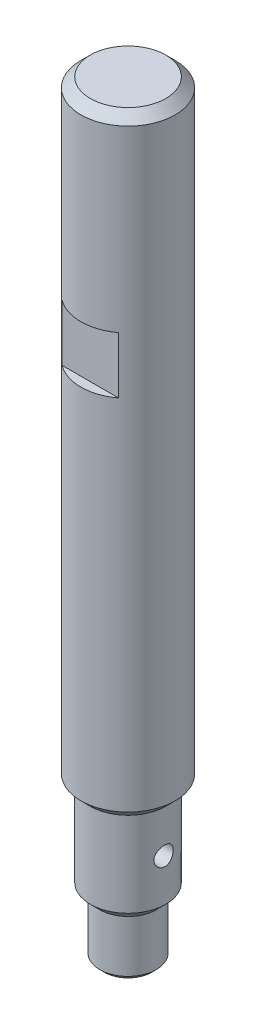
ISO-10303-21;
HEADER;
FILE_DESCRIPTION(('STEP AP214'),'2;1');
FILE_NAME('part.step','',(''),(''),'','','');
FILE_SCHEMA(('AUTOMOTIVE_DESIGN { 1 0 10303 214 1 1 1 1 }'));
ENDSEC;
DATA;
#1=APPLICATION_CONTEXT('core data for automotive mechanical design processes');
#2=APPLICATION_PROTOCOL_DEFINITION('international standard','automotive_design',2000,#1);
#3=PRODUCT_CONTEXT('',#1,'mechanical');
#4=PRODUCT('Part','Part','',(#3));
#5=PRODUCT_RELATED_PRODUCT_CATEGORY('part','',(#4));
#6=PRODUCT_DEFINITION_FORMATION('','',#4);
#7=PRODUCT_DEFINITION_CONTEXT('part definition',#1,'design');
#8=PRODUCT_DEFINITION('design','',#6,#7);
#9=PRODUCT_DEFINITION_SHAPE('','',#8);
#10=(LENGTH_UNIT() NAMED_UNIT(*) SI_UNIT(.MILLI.,.METRE.));
#11=(NAMED_UNIT(*) PLANE_ANGLE_UNIT() SI_UNIT($,.RADIAN.));
#12=(NAMED_UNIT(*) SI_UNIT($,.STERADIAN.) SOLID_ANGLE_UNIT());
#13=UNCERTAINTY_MEASURE_WITH_UNIT(LENGTH_MEASURE(1.E-05),#10,'distance_accuracy_value','');
#14=(GEOMETRIC_REPRESENTATION_CONTEXT(3) GLOBAL_UNCERTAINTY_ASSIGNED_CONTEXT((#13)) GLOBAL_UNIT_ASSIGNED_CONTEXT((#10,
#11,#12)) REPRESENTATION_CONTEXT('',''));
#15=CARTESIAN_POINT('',(0.,0.,0.));
#16=DIRECTION('',(0.,0.,1.));
#17=DIRECTION('',(1.,0.,0.));
#18=AXIS2_PLACEMENT_3D('',#15,#16,#17);
#19=CARTESIAN_POINT('',(0.,0.,0.));
#20=DIRECTION('',(0.,-1.,0.));
#21=DIRECTION('',(0.,0.,-1.));
#22=AXIS2_PLACEMENT_3D('',#19,#20,#21);
#23=CYLINDRICAL_SURFACE('',#22,10.);
#24=DIRECTION('',(0.,-1.,0.));
#25=VECTOR('',#24,1.);
#26=CARTESIAN_POINT('',(6.,0.,-8.));
#27=LINE('',#26,#25);
#28=CARTESIAN_POINT('',(6.,122.,-8.));
#29=VERTEX_POINT('',#28);
#30=CARTESIAN_POINT('',(6.,110.,-8.));
#31=VERTEX_POINT('',#30);
#32=EDGE_CURVE('E100',#29,#31,#27,.T.);
#33=ORIENTED_EDGE('',*,*,#32,.F.);
#34=CARTESIAN_POINT('',(0.,122.,0.));
#35=DIRECTION('',(0.,1.,0.));
#36=DIRECTION('',(0.,0.,1.));
#37=AXIS2_PLACEMENT_3D('',#34,#35,#36);
#38=CIRCLE('',#37,10.);
#39=CARTESIAN_POINT('',(-6.,122.,-8.));
#40=VERTEX_POINT('',#39);
#41=EDGE_CURVE('E88',#29,#40,#38,.T.);
#42=ORIENTED_EDGE('',*,*,#41,.T.);
#43=DIRECTION('',(0.,-1.,0.));
#44=VECTOR('',#43,1.);
#45=CARTESIAN_POINT('',(-6.,0.,-8.));
#46=LINE('',#45,#44);
#47=CARTESIAN_POINT('',(-6.,110.,-8.));
#48=VERTEX_POINT('',#47);
#49=EDGE_CURVE('E96',#48,#40,#46,.F.);
#50=ORIENTED_EDGE('',*,*,#49,.F.);
#51=CARTESIAN_POINT('',(0.,110.,0.));
#52=DIRECTION('',(0.,1.,0.));
#53=DIRECTION('',(0.,0.,1.));
#54=AXIS2_PLACEMENT_3D('',#51,#52,#53);
#55=CIRCLE('',#54,10.);
#56=EDGE_CURVE('E95',#31,#48,#55,.T.);
#57=ORIENTED_EDGE('',*,*,#56,.F.);
#58=EDGE_LOOP('',(#33,#42,#50,#57));
#59=FACE_BOUND('',#58,.T.);
#60=CARTESIAN_POINT('',(0.,34.,0.));
#61=DIRECTION('',(0.,-1.,0.));
#62=DIRECTION('',(0.,0.,-1.));
#63=AXIS2_PLACEMENT_3D('',#60,#61,#62);
#64=CIRCLE('',#63,10.);
#65=CARTESIAN_POINT('',(0.,34.,-10.));
#66=VERTEX_POINT('',#65);
#67=EDGE_CURVE('E161',#66,#66,#64,.T.);
#68=ORIENTED_EDGE('',*,*,#67,.F.);
#69=EDGE_LOOP('',(#68));
#70=FACE_BOUND('',#69,.T.);
#71=CARTESIAN_POINT('',(0.,160.,0.));
#72=DIRECTION('',(0.,-1.,0.));
#73=DIRECTION('',(0.,0.,-1.));
#74=AXIS2_PLACEMENT_3D('',#71,#72,#73);
#75=CIRCLE('',#74,10.);
#76=CARTESIAN_POINT('',(0.,160.,-10.));
#77=VERTEX_POINT('',#76);
#78=EDGE_CURVE('E162',#77,#77,#75,.T.);
#79=ORIENTED_EDGE('',*,*,#78,.T.);
#80=EDGE_LOOP('',(#79));
#81=FACE_BOUND('',#80,.T.);
#82=DIRECTION('',(0.,-1.,0.));
#83=VECTOR('',#82,1.);
#84=CARTESIAN_POINT('',(-6.,0.,8.));
#85=LINE('',#84,#83);
#86=CARTESIAN_POINT('',(-6.,122.,8.));
#87=VERTEX_POINT('',#86);
#88=CARTESIAN_POINT('',(-6.,110.,8.));
#89=VERTEX_POINT('',#88);
#90=EDGE_CURVE('E12',#87,#89,#85,.T.);
#91=ORIENTED_EDGE('',*,*,#90,.F.);
#92=CARTESIAN_POINT('',(6.,122.,8.));
#93=VERTEX_POINT('',#92);
#94=EDGE_CURVE('E98',#87,#93,#38,.T.);
#95=ORIENTED_EDGE('',*,*,#94,.T.);
#96=DIRECTION('',(0.,-1.,0.));
#97=VECTOR('',#96,1.);
#98=CARTESIAN_POINT('',(6.,0.,8.));
#99=LINE('',#98,#97);
#100=CARTESIAN_POINT('',(6.,110.,8.));
#101=VERTEX_POINT('',#100);
#102=EDGE_CURVE('E105',#101,#93,#99,.F.);
#103=ORIENTED_EDGE('',*,*,#102,.F.);
#104=EDGE_CURVE('E55',#89,#101,#55,.T.);
#105=ORIENTED_EDGE('',*,*,#104,.F.);
#106=EDGE_LOOP('',(#91,#95,#103,#105));
#107=FACE_BOUND('',#106,.T.);
#108=ADVANCED_FACE('F41',(#59,#70,#81,#107),#23,.T.);
#109=CARTESIAN_POINT('',(-5.,0.,0.));
#110=DIRECTION('',(0.,1.,0.));
#111=DIRECTION('',(0.,0.,1.));
#112=AXIS2_PLACEMENT_3D('',#109,#110,#111);
#113=PLANE('',#112);
#114=CARTESIAN_POINT('',(0.,0.,0.));
#115=DIRECTION('',(0.,-1.,0.));
#116=DIRECTION('',(0.,0.,-1.));
#117=AXIS2_PLACEMENT_3D('',#114,#115,#116);
#118=CIRCLE('',#117,5.);
#119=CARTESIAN_POINT('',(0.,0.,-5.));
#120=VERTEX_POINT('',#119);
#121=EDGE_CURVE('E179',#120,#120,#118,.T.);
#122=ORIENTED_EDGE('',*,*,#121,.T.);
#123=EDGE_LOOP('',(#122));
#124=FACE_BOUND('',#123,.T.);
#125=ADVANCED_FACE('F43',(#124),#113,.F.);
#126=CARTESIAN_POINT('',(0.,1.,0.));
#127=DIRECTION('',(0.,1.,0.));
#128=DIRECTION('',(0.,0.,1.));
#129=AXIS2_PLACEMENT_3D('',#126,#127,#128);
#130=CONICAL_SURFACE('',#129,6.00000000000001,0.785398163397448);
#131=ORIENTED_EDGE('',*,*,#121,.F.);
#132=EDGE_LOOP('',(#131));
#133=FACE_BOUND('',#132,.T.);
#134=CARTESIAN_POINT('',(0.,1.,0.));
#135=DIRECTION('',(0.,-1.,0.));
#136=DIRECTION('',(0.,0.,-1.));
#137=AXIS2_PLACEMENT_3D('',#134,#135,#136);
#138=CIRCLE('',#137,6.00000000000001);
#139=CARTESIAN_POINT('',(0.,1.,-6.00000000000001));
#140=VERTEX_POINT('',#139);
#141=EDGE_CURVE('E176',#140,#140,#138,.T.);
#142=ORIENTED_EDGE('',*,*,#141,.T.);
#143=EDGE_LOOP('',(#142));
#144=FACE_BOUND('',#143,.T.);
#145=ADVANCED_FACE('F185',(#133,#144),#130,.T.);
#146=CARTESIAN_POINT('',(0.,0.,0.));
#147=DIRECTION('',(0.,-1.,0.));
#148=DIRECTION('',(0.,0.,-1.));
#149=AXIS2_PLACEMENT_3D('',#146,#147,#148);
#150=CYLINDRICAL_SURFACE('',#149,6.00000000000001);
#151=ORIENTED_EDGE('',*,*,#141,.F.);
#152=EDGE_LOOP('',(#151));
#153=FACE_BOUND('',#152,.T.);
#154=CARTESIAN_POINT('',(0.,12.,0.));
#155=DIRECTION('',(0.,-1.,0.));
#156=DIRECTION('',(0.,0.,-1.));
#157=AXIS2_PLACEMENT_3D('',#154,#155,#156);
#158=CIRCLE('',#157,6.00000000000001);
#159=CARTESIAN_POINT('',(0.,12.,-6.00000000000001));
#160=VERTEX_POINT('',#159);
#161=EDGE_CURVE('E173',#160,#160,#158,.T.);
#162=ORIENTED_EDGE('',*,*,#161,.T.);
#163=EDGE_LOOP('',(#162));
#164=FACE_BOUND('',#163,.T.);
#165=ADVANCED_FACE('F188',(#153,#164),#150,.T.);
#166=CARTESIAN_POINT('',(0.,14.,0.));
#167=DIRECTION('',(0.,1.,0.));
#168=DIRECTION('',(0.,0.,1.));
#169=AXIS2_PLACEMENT_3D('',#166,#167,#168);
#170=CONICAL_SURFACE('',#169,8.,0.785398163397447);
#171=ORIENTED_EDGE('',*,*,#161,.F.);
#172=EDGE_LOOP('',(#171));
#173=FACE_BOUND('',#172,.T.);
#174=CARTESIAN_POINT('',(0.,14.,0.));
#175=DIRECTION('',(0.,-1.,0.));
#176=DIRECTION('',(0.,0.,-1.));
#177=AXIS2_PLACEMENT_3D('',#174,#175,#176);
#178=CIRCLE('',#177,8.);
#179=CARTESIAN_POINT('',(0.,14.,-8.));
#180=VERTEX_POINT('',#179);
#181=EDGE_CURVE('E164',#180,#180,#178,.T.);
#182=ORIENTED_EDGE('',*,*,#181,.T.);
#183=EDGE_LOOP('',(#182));
#184=FACE_BOUND('',#183,.T.);
#185=ADVANCED_FACE('F153',(#173,#184),#170,.T.);
#186=CARTESIAN_POINT('',(0.,0.,0.));
#187=DIRECTION('',(0.,-1.,0.));
#188=DIRECTION('',(0.,0.,-1.));
#189=AXIS2_PLACEMENT_3D('',#186,#187,#188);
#190=CYLINDRICAL_SURFACE('',#189,8.);
#191=CARTESIAN_POINT('',(-7.6878530023607,23.,-2.21289769625565));
#192=CARTESIAN_POINT('',(-7.68785519637858,23.1104406007413,-2.21289461847712));
#193=CARTESIAN_POINT('',(-7.69049303598907,23.2209159189428,-2.20378804714844));
#194=CARTESIAN_POINT('',(-7.70075405823386,23.4386940625388,-2.16765483481698));
#195=CARTESIAN_POINT('',(-7.70838014227023,23.5459950035745,-2.14061776444935));
#196=CARTESIAN_POINT('',(-7.72776564137848,23.7542428305497,-2.06953702771702));
#197=CARTESIAN_POINT('',(-7.73951971883695,23.8551977243086,-2.02551531576586));
#198=CARTESIAN_POINT('',(-7.7659321372638,24.0482486820319,-1.92175750720661));
#199=CARTESIAN_POINT('',(-7.78059060152744,24.1403443696642,-1.86202074343742));
#200=CARTESIAN_POINT('',(-7.81165916050296,24.3150893162098,-1.72709456725526));
#201=CARTESIAN_POINT('',(-7.82809823998061,24.39751488028,-1.65162206177369));
#202=CARTESIAN_POINT('',(-7.86085182053152,24.5486091154883,-1.48793937247701));
#203=CARTESIAN_POINT('',(-7.87716630982097,24.6172765004974,-1.39972799914442));
#204=CARTESIAN_POINT('',(-7.908314903658,24.739820374105,-1.21151388961081));
#205=CARTESIAN_POINT('',(-7.92312517547245,24.7934771105292,-1.11136379859715));
#206=CARTESIAN_POINT('',(-7.94956278437088,24.8830477153225,-0.903028650066129));
#207=CARTESIAN_POINT('',(-7.96119059096249,24.9189642015324,-0.794844780765564));
#208=CARTESIAN_POINT('',(-7.97999140643364,24.9713182676629,-0.575819929483655));
#209=CARTESIAN_POINT('',(-7.98724988955784,24.9881357154613,-0.465077173996437));
#210=CARTESIAN_POINT('',(-7.99711253348809,25.0030067034204,-0.242141272483955));
#211=CARTESIAN_POINT('',(-7.99971738235399,25.0010630177677,-0.129948343344262));
#212=CARTESIAN_POINT('',(-8.00023308931063,24.9787401197999,0.0900666038461489));
#213=CARTESIAN_POINT('',(-7.99824682223238,24.9587709399569,0.197930369346317));
#214=CARTESIAN_POINT('',(-7.99024389049299,24.9016229839612,0.408835426685927));
#215=CARTESIAN_POINT('',(-7.98422701127596,24.8644432916981,0.511876461491335));
#216=CARTESIAN_POINT('',(-7.96895142303004,24.7735979434503,0.711274728515492));
#217=CARTESIAN_POINT('',(-7.95966391374083,24.7197863642706,0.807563157139181));
#218=CARTESIAN_POINT('',(-7.93904577786586,24.597315456707,0.989943490553899));
#219=CARTESIAN_POINT('',(-7.92771479588107,24.5286535451515,1.07603361734292));
#220=CARTESIAN_POINT('',(-7.90406513248655,24.3762330064141,1.23799957743736));
#221=CARTESIAN_POINT('',(-7.89172801921813,24.2921160861218,1.31353590344543));
#222=CARTESIAN_POINT('',(-7.86789538481757,24.1123200211678,1.44948240411961));
#223=CARTESIAN_POINT('',(-7.85639990303849,24.0166403364072,1.50989187180207));
#224=CARTESIAN_POINT('',(-7.83566625930742,23.8157679726808,1.61405751224661));
#225=CARTESIAN_POINT('',(-7.82643931315683,23.7105314157494,1.65773151448441));
#226=CARTESIAN_POINT('',(-7.81154542593974,23.4939316255388,1.7265606318715));
#227=CARTESIAN_POINT('',(-7.80587772309417,23.3825697088135,1.75171970993817));
#228=CARTESIAN_POINT('',(-7.79896966457027,23.1600323987815,1.78222115971227));
#229=CARTESIAN_POINT('',(-7.79761632687027,23.0489297653363,1.78806938250854));
#230=CARTESIAN_POINT('',(-7.79919650109214,22.8273424507375,1.78116438221919));
#231=CARTESIAN_POINT('',(-7.80212961839417,22.716857713639,1.76841287146341));
#232=CARTESIAN_POINT('',(-7.81181337544287,22.5015085880362,1.72512182338862));
#233=CARTESIAN_POINT('',(-7.81850076946074,22.3965818187433,1.69487673909723));
#234=CARTESIAN_POINT('',(-7.83481095553363,22.1932548337187,1.61780073582342));
#235=CARTESIAN_POINT('',(-7.84443409529411,22.0948553927557,1.5709678521003));
#236=CARTESIAN_POINT('',(-7.86566131214424,21.9052469777061,1.4610121964152));
#237=CARTESIAN_POINT('',(-7.87730054636348,21.8142169279655,1.39758788534769));
#238=CARTESIAN_POINT('',(-7.90100573612776,21.6438493097589,1.25666358258211));
#239=CARTESIAN_POINT('',(-7.91307176153585,21.5645136666799,1.17916127773768));
#240=CARTESIAN_POINT('',(-7.93645791898481,21.4177511659432,1.009996699345));
#241=CARTESIAN_POINT('',(-7.94775183376073,21.350671949961,0.918028647084851));
#242=CARTESIAN_POINT('',(-7.96777698428061,21.232851306439,0.723903886958923));
#243=CARTESIAN_POINT('',(-7.97650835369288,21.1821090267134,0.621747710901891));
#244=CARTESIAN_POINT('',(-7.9901344545141,21.0988431723777,0.41087913152483));
#245=CARTESIAN_POINT('',(-7.99505688360013,21.0661885724967,0.302220370196402));
#246=CARTESIAN_POINT('',(-8.00035663039973,21.0196317323133,0.0808547174542219));
#247=CARTESIAN_POINT('',(-8.000734825382,21.0057258730088,-0.031851388401925));
#248=CARTESIAN_POINT('',(-7.99669677656592,20.9972648208489,-0.254838633257147));
#249=CARTESIAN_POINT('',(-7.99240989057916,21.0021965818092,-0.365102942588617));
#250=CARTESIAN_POINT('',(-7.97947146384664,21.0300956545887,-0.583056326992785));
#251=CARTESIAN_POINT('',(-7.97082005290949,21.0530624300263,-0.690745478555421));
#252=CARTESIAN_POINT('',(-7.94990948473234,21.1161044395417,-0.899968572705852));
#253=CARTESIAN_POINT('',(-7.93767000009939,21.1560869066288,-1.00153253022463));
#254=CARTESIAN_POINT('',(-7.91063264548255,21.2519411580391,-1.19649004919453));
#255=CARTESIAN_POINT('',(-7.8958344530855,21.307814945341,-1.28988257875852));
#256=CARTESIAN_POINT('',(-7.86463711865894,21.4354304679923,-1.46829451408179));
#257=CARTESIAN_POINT('',(-7.84820811577873,21.5075202858077,-1.5530597213457));
#258=CARTESIAN_POINT('',(-7.81563431920909,21.6648457039547,-1.70946080415712));
#259=CARTESIAN_POINT('',(-7.79948959862497,21.7500846322223,-1.78109334585851));
#260=CARTESIAN_POINT('',(-7.76880663577857,21.9332028283789,-1.91053966678728));
#261=CARTESIAN_POINT('',(-7.75430398294272,22.0312882467305,-1.96807071281332));
#262=CARTESIAN_POINT('',(-7.72883772393194,22.2361109797496,-2.06582602066884));
#263=CARTESIAN_POINT('',(-7.71787154435114,22.3428419321877,-2.10606287419079));
#264=CARTESIAN_POINT('',(-7.70233052925585,22.5411540236703,-2.16212277083803));
#265=CARTESIAN_POINT('',(-7.69693948718059,22.6317863287723,-2.18112258183479));
#266=CARTESIAN_POINT('',(-7.68969995559106,22.8149377379954,-2.20651079616254));
#267=CARTESIAN_POINT('',(-7.687851163891,22.9074566804888,-2.21290027526953));
#268=CARTESIAN_POINT('',(-7.6878530023607,23.,-2.21289769625565));
#269=B_SPLINE_CURVE_WITH_KNOTS('',3,(#191,#192,#193,#194,#195,#196,#197,#198,#199,#200,#201,
#202,#203,#204,#205,#206,#207,#208,#209,#210,#211,#212,#213,#214,#215,#216,#217,#218,#219,#220,
#221,#222,#223,#224,#225,#226,#227,#228,#229,#230,#231,#232,#233,#234,#235,#236,#237,#238,#239,
#240,#241,#242,#243,#244,#245,#246,#247,#248,#249,#250,#251,#252,#253,#254,#255,#256,#257,#258,
#259,#260,#261,#262,#263,#264,#265,#266,#267,#268),.UNSPECIFIED.,.T.,.F.,(4,2,2,2,2,2,2,2,2,2,2,
2,2,2,2,2,2,2,2,2,2,2,2,2,2,2,2,2,2,2,2,2,2,2,2,2,2,2,4),(0.,0.33098195338891,0.662156593142934,
0.992904581732817,1.32366661404383,1.66099163354381,1.99834817183894,2.34041197118336,
2.68242527877674,3.01751000796277,3.35254518932817,3.68014610151158,4.00776445379829,
4.33834299403556,4.66897908375131,5.0085637325753,5.34816424959842,5.68941145606722,
6.03058560103638,6.36274859809374,6.69488101747042,7.02157924007366,7.34831617137135,
7.68146276687326,8.01466415108036,8.35620264772256,8.69772332575643,9.03673658245544,
9.37568439127231,9.70546756901966,10.0352409390159,10.3632390124777,10.6912784459046,
11.0271767726566,11.3631602525241,11.7054118182895,12.0474137709606,12.3247826174462,
12.6021278008238),.UNSPECIFIED.);
#270=CARTESIAN_POINT('',(-7.6878530023607,23.,-2.21289769625565));
#271=VERTEX_POINT('',#270);
#272=EDGE_CURVE('E45',#271,#271,#269,.T.);
#273=ORIENTED_EDGE('',*,*,#272,.T.);
#274=EDGE_LOOP('',(#273));
#275=FACE_BOUND('',#274,.T.);
#276=CARTESIAN_POINT('',(7.79818586762298,23.,-1.78558034655551));
#277=CARTESIAN_POINT('',(7.79818788857683,22.8895593992587,-1.78557715247025));
#278=CARTESIAN_POINT('',(7.80031952836752,22.7790840810572,-1.77633897348423));
#279=CARTESIAN_POINT('',(7.80857235476763,22.5613059374612,-1.73969489528177));
#280=CARTESIAN_POINT('',(7.81469586323221,22.4540049964255,-1.7122784225714));
#281=CARTESIAN_POINT('',(7.8301320853809,22.2457571694503,-1.64023682517196));
#282=CARTESIAN_POINT('',(7.83944068025951,22.1448022756914,-1.59563391583416));
#283=CARTESIAN_POINT('',(7.860091137509,21.9517513179681,-1.49057746767622));
#284=CARTESIAN_POINT('',(7.87143308619662,21.8596556303358,-1.43012325591103));
#285=CARTESIAN_POINT('',(7.89501380547509,21.6849106837902,-1.29368910309633));
#286=CARTESIAN_POINT('',(7.90726590543403,21.60248511972,-1.21742490137406));
#287=CARTESIAN_POINT('',(7.93094329160767,21.4513908845117,-1.0521850720402));
#288=CARTESIAN_POINT('',(7.94236850046002,21.3827234995026,-0.963208257371007));
#289=CARTESIAN_POINT('',(7.96309054615463,21.260179625895,-0.773562844171043));
#290=CARTESIAN_POINT('',(7.97235546058291,21.2065228894708,-0.6727484293193));
#291=CARTESIAN_POINT('',(7.98726410629532,21.1169522846775,-0.463272384004493));
#292=CARTESIAN_POINT('',(7.99290837189739,21.0810357984676,-0.354611914058947));
#293=CARTESIAN_POINT('',(7.99960235645673,21.0286817323371,-0.134883566520079));
#294=CARTESIAN_POINT('',(8.00074283633875,21.0118642845387,-0.0239090524377696));
#295=CARTESIAN_POINT('',(7.99829657368844,20.9969932965796,0.199231494589265));
#296=CARTESIAN_POINT('',(7.99471053012922,20.9989369822323,0.31139734892181));
#297=CARTESIAN_POINT('',(7.98309263075517,21.0212598802001,0.531105945374017));
#298=CARTESIAN_POINT('',(7.97516119104848,21.0412290600431,0.638696044495455));
#299=CARTESIAN_POINT('',(7.95553998442127,21.0983770160388,0.848838849222006));
#300=CARTESIAN_POINT('',(7.94385001744559,21.1355567083019,0.951391286352429));
#301=CARTESIAN_POINT('',(7.91760176792042,21.2264020565497,1.14964375641361));
#302=CARTESIAN_POINT('',(7.90301852313973,21.2802136357294,1.24527350224242));
#303=CARTESIAN_POINT('',(7.87237431704489,21.402684543293,1.4262393171806));
#304=CARTESIAN_POINT('',(7.85631309892123,21.4713464548485,1.51157359139486));
#305=CARTESIAN_POINT('',(7.82376773793214,21.6237669935859,1.67198892197793));
#306=CARTESIAN_POINT('',(7.80728391353528,21.7078839138782,1.74672997123367));
#307=CARTESIAN_POINT('',(7.77599071456179,21.8876799788322,1.88115534534894));
#308=CARTESIAN_POINT('',(7.76118141826526,21.9833596635928,1.94083896647077));
#309=CARTESIAN_POINT('',(7.73473506392444,22.1842320273192,2.04370273547456));
#310=CARTESIAN_POINT('',(7.72311373594475,22.2894685842506,2.08680145636884));
#311=CARTESIAN_POINT('',(7.70444690014604,22.5060683744612,2.15470450871544));
#312=CARTESIAN_POINT('',(7.6974004131703,22.6174302911865,2.17951275504627));
#313=CARTESIAN_POINT('',(7.6888208504741,22.8399676012185,2.20958684380775));
#314=CARTESIAN_POINT('',(7.68714706927097,22.9510702346637,2.21535153714643));
#315=CARTESIAN_POINT('',(7.68910561828854,23.1726575492625,2.20854418337913));
#316=CARTESIAN_POINT('',(7.69273746006269,23.283142286361,2.1959738242359));
#317=CARTESIAN_POINT('',(7.70479378564939,23.4984914119638,2.15328266581475));
#318=CARTESIAN_POINT('',(7.71313888222965,23.6034181812567,2.12345238379113));
#319=CARTESIAN_POINT('',(7.73367463991861,23.8067451662813,2.04739309700419));
#320=CARTESIAN_POINT('',(7.74586575655017,23.9051446072443,2.00116214966424));
#321=CARTESIAN_POINT('',(7.77312422590771,24.0947530222939,1.89254439420673));
#322=CARTESIAN_POINT('',(7.78824331077318,24.1857830720345,1.82985844458141));
#323=CARTESIAN_POINT('',(7.81968376213726,24.3561506902411,1.69045581494427));
#324=CARTESIAN_POINT('',(7.83600532595207,24.4354863333201,1.61373682915857));
#325=CARTESIAN_POINT('',(7.86868455295476,24.5822488340568,1.44611930302986));
#326=CARTESIAN_POINT('',(7.88503290107398,24.6493280500391,1.35491400350585));
#327=CARTESIAN_POINT('',(7.915732675747,24.767148693561,1.16218893253085));
#328=CARTESIAN_POINT('',(7.93008420643889,24.8178909732866,1.06066969945057));
#329=CARTESIAN_POINT('',(7.9553180139601,24.9011568276223,0.85087340932591));
#330=CARTESIAN_POINT('',(7.96622498820849,24.9338114275033,0.742651440048502));
#331=CARTESIAN_POINT('',(7.98372397740615,24.9803682676867,0.521914889139571));
#332=CARTESIAN_POINT('',(7.99031682496929,24.9942741269912,0.409401140247665));
#333=CARTESIAN_POINT('',(7.9985816509872,25.0027351791511,0.186530527879732));
#334=CARTESIAN_POINT('',(8.00038186233449,24.9978034181908,0.0761976019558974));
#335=CARTESIAN_POINT('',(7.99948225939152,24.9699043454113,-0.142137625101233));
#336=CARTESIAN_POINT('',(7.99678257893043,24.9469375699737,-0.250139995449721));
#337=CARTESIAN_POINT('',(7.98744152977426,24.8838955604583,-0.460197844120115));
#338=CARTESIAN_POINT('',(7.98082145893772,24.8439130933712,-0.562282206845631));
#339=CARTESIAN_POINT('',(7.96457626482022,24.7480588419609,-0.75843405214835));
#340=CARTESIAN_POINT('',(7.95495076271284,24.692185054659,-0.852500522188218));
#341=CARTESIAN_POINT('',(7.93363950536243,24.5645695320077,-1.03236136465056));
#342=CARTESIAN_POINT('',(7.92190991681853,24.4924797141923,-1.1179035720731));
#343=CARTESIAN_POINT('',(7.89801049364372,24.3351542960453,-1.27586296083951));
#344=CARTESIAN_POINT('',(7.88584054816047,24.2499153677777,-1.34827680937883));
#345=CARTESIAN_POINT('',(7.86234264921977,24.0667971716211,-1.47921818158944));
#346=CARTESIAN_POINT('',(7.85103463958599,23.9687117532695,-1.53746143969071));
#347=CARTESIAN_POINT('',(7.83099789145562,23.7638890202504,-1.63647234457645));
#348=CARTESIAN_POINT('',(7.82226727784348,23.6571580678123,-1.67725270580463));
#349=CARTESIAN_POINT('',(7.8098413588092,23.4588459763297,-1.73408431407366));
#350=CARTESIAN_POINT('',(7.80550627309105,23.3682136712277,-1.75335250507297));
#351=CARTESIAN_POINT('',(7.7996778019732,23.1850622620046,-1.77910131414866));
#352=CARTESIAN_POINT('',(7.79818417417168,23.0925433195112,-1.78558302302822));
#353=CARTESIAN_POINT('',(7.79818586762298,23.,-1.78558034655551));
#354=B_SPLINE_CURVE_WITH_KNOTS('',3,(#276,#277,#278,#279,#280,#281,#282,#283,#284,#285,#286,
#287,#288,#289,#290,#291,#292,#293,#294,#295,#296,#297,#298,#299,#300,#301,#302,#303,#304,#305,
#306,#307,#308,#309,#310,#311,#312,#313,#314,#315,#316,#317,#318,#319,#320,#321,#322,#323,#324,
#325,#326,#327,#328,#329,#330,#331,#332,#333,#334,#335,#336,#337,#338,#339,#340,#341,#342,#343,
#344,#345,#346,#347,#348,#349,#350,#351,#352,#353),.UNSPECIFIED.,.T.,.F.,(4,2,2,2,2,2,2,2,2,2,2,
2,2,2,2,2,2,2,2,2,2,2,2,2,2,2,2,2,2,2,2,2,2,2,2,2,2,2,4),(0.,0.330981953388906,
0.662156593142934,0.992904581732809,1.32366661404383,1.66099163354381,1.99834817183894,
2.34041197118336,2.68242527877674,3.01751000796277,3.35254518932817,3.68014610151158,
4.00776445379829,4.33834299403556,4.66897908375131,5.00856373257529,5.34816424959842,
5.68941145606722,6.03058560103638,6.36274859809374,6.69488101747042,7.02157924007366,
7.34831617137134,7.68146276687327,8.01466415108036,8.35620264772256,8.69772332575643,
9.03673658245544,9.37568439127231,9.70546756901966,10.0352409390159,10.3632390124777,
10.6912784459046,11.0271767726566,11.3631602525241,11.7054118182895,12.0474137709606,
12.3247826174462,12.6021278008238),.UNSPECIFIED.);
#355=CARTESIAN_POINT('',(7.79818586762298,23.,-1.78558034655551));
#356=VERTEX_POINT('',#355);
#357=EDGE_CURVE('E109',#356,#356,#354,.T.);
#358=ORIENTED_EDGE('',*,*,#357,.T.);
#359=EDGE_LOOP('',(#358));
#360=FACE_BOUND('',#359,.T.);
#361=ORIENTED_EDGE('',*,*,#181,.F.);
#362=EDGE_LOOP('',(#361));
#363=FACE_BOUND('',#362,.T.);
#364=CARTESIAN_POINT('',(0.,32.,0.));
#365=DIRECTION('',(0.,-1.,0.));
#366=DIRECTION('',(0.,0.,-1.));
#367=AXIS2_PLACEMENT_3D('',#364,#365,#366);
#368=CIRCLE('',#367,8.);
#369=CARTESIAN_POINT('',(0.,32.,-8.));
#370=VERTEX_POINT('',#369);
#371=EDGE_CURVE('E158',#370,#370,#368,.T.);
#372=ORIENTED_EDGE('',*,*,#371,.T.);
#373=EDGE_LOOP('',(#372));
#374=FACE_BOUND('',#373,.T.);
#375=ADVANCED_FACE('F114',(#275,#360,#363,#374),#190,.T.);
#376=CARTESIAN_POINT('',(0.,34.,0.));
#377=DIRECTION('',(0.,1.,0.));
#378=DIRECTION('',(0.,0.,1.));
#379=AXIS2_PLACEMENT_3D('',#376,#377,#378);
#380=CONICAL_SURFACE('',#379,10.,0.785398163397451);
#381=ORIENTED_EDGE('',*,*,#371,.F.);
#382=EDGE_LOOP('',(#381));
#383=FACE_BOUND('',#382,.T.);
#384=ORIENTED_EDGE('',*,*,#67,.T.);
#385=EDGE_LOOP('',(#384));
#386=FACE_BOUND('',#385,.T.);
#387=ADVANCED_FACE('F144',(#383,#386),#380,.T.);
#388=CARTESIAN_POINT('',(0.,162.,0.));
#389=DIRECTION('',(0.,-1.,0.));
#390=DIRECTION('',(0.,0.,-1.));
#391=AXIS2_PLACEMENT_3D('',#388,#389,#390);
#392=CONICAL_SURFACE('',#391,8.00000000000001,0.785398163397446);
#393=ORIENTED_EDGE('',*,*,#78,.F.);
#394=EDGE_LOOP('',(#393));
#395=FACE_BOUND('',#394,.T.);
#396=CARTESIAN_POINT('',(0.,162.,0.));
#397=DIRECTION('',(0.,-1.,0.));
#398=DIRECTION('',(0.,0.,-1.));
#399=AXIS2_PLACEMENT_3D('',#396,#397,#398);
#400=CIRCLE('',#399,8.00000000000001);
#401=CARTESIAN_POINT('',(0.,162.,-8.00000000000001));
#402=VERTEX_POINT('',#401);
#403=EDGE_CURVE('E167',#402,#402,#400,.T.);
#404=ORIENTED_EDGE('',*,*,#403,.T.);
#405=EDGE_LOOP('',(#404));
#406=FACE_BOUND('',#405,.T.);
#407=ADVANCED_FACE('F140',(#395,#406),#392,.T.);
#408=CARTESIAN_POINT('',(-8.00000000000001,162.,0.));
#409=DIRECTION('',(0.,-1.,0.));
#410=DIRECTION('',(0.,0.,-1.));
#411=AXIS2_PLACEMENT_3D('',#408,#409,#410);
#412=PLANE('',#411);
#413=ORIENTED_EDGE('',*,*,#403,.F.);
#414=EDGE_LOOP('',(#413));
#415=FACE_BOUND('',#414,.T.);
#416=ADVANCED_FACE('F130',(#415),#412,.F.);
#417=CARTESIAN_POINT('',(-10.,110.,-8.));
#418=DIRECTION('',(0.,0.,-1.));
#419=DIRECTION('',(-1.,0.,0.));
#420=AXIS2_PLACEMENT_3D('',#417,#418,#419);
#421=PLANE('',#420);
#422=ORIENTED_EDGE('',*,*,#32,.T.);
#423=DIRECTION('',(-1.,0.,0.));
#424=VECTOR('',#423,1.);
#425=CARTESIAN_POINT('',(-10.,110.,-8.));
#426=LINE('',#425,#424);
#427=EDGE_CURVE('E70',#31,#48,#426,.T.);
#428=ORIENTED_EDGE('',*,*,#427,.T.);
#429=ORIENTED_EDGE('',*,*,#49,.T.);
#430=DIRECTION('',(-1.,0.,0.));
#431=VECTOR('',#430,1.);
#432=CARTESIAN_POINT('',(-10.,122.,-8.));
#433=LINE('',#432,#431);
#434=EDGE_CURVE('E91',#29,#40,#433,.T.);
#435=ORIENTED_EDGE('',*,*,#434,.F.);
#436=EDGE_LOOP('',(#422,#428,#429,#435));
#437=FACE_BOUND('',#436,.T.);
#438=ADVANCED_FACE('F99',(#437),#421,.T.);
#439=CARTESIAN_POINT('',(0.,122.,0.));
#440=DIRECTION('',(0.,1.,0.));
#441=DIRECTION('',(0.,0.,1.));
#442=AXIS2_PLACEMENT_3D('',#439,#440,#441);
#443=PLANE('',#442);
#444=ORIENTED_EDGE('',*,*,#434,.T.);
#445=ORIENTED_EDGE('',*,*,#41,.F.);
#446=EDGE_LOOP('',(#444,#445));
#447=FACE_BOUND('',#446,.T.);
#448=ADVANCED_FACE('F90',(#447),#443,.F.);
#449=CARTESIAN_POINT('',(0.,110.,0.));
#450=DIRECTION('',(0.,1.,0.));
#451=DIRECTION('',(0.,0.,1.));
#452=AXIS2_PLACEMENT_3D('',#449,#450,#451);
#453=PLANE('',#452);
#454=ORIENTED_EDGE('',*,*,#56,.T.);
#455=ORIENTED_EDGE('',*,*,#427,.F.);
#456=EDGE_LOOP('',(#454,#455));
#457=FACE_BOUND('',#456,.T.);
#458=ADVANCED_FACE('F131',(#457),#453,.T.);
#459=ORIENTED_EDGE('',*,*,#104,.T.);
#460=DIRECTION('',(1.,0.,0.));
#461=VECTOR('',#460,1.);
#462=CARTESIAN_POINT('',(-10.,110.,8.));
#463=LINE('',#462,#461);
#464=EDGE_CURVE('E62',#89,#101,#463,.T.);
#465=ORIENTED_EDGE('',*,*,#464,.F.);
#466=EDGE_LOOP('',(#459,#465));
#467=FACE_BOUND('',#466,.T.);
#468=ADVANCED_FACE('F134',(#467),#453,.T.);
#469=DIRECTION('',(1.,0.,0.));
#470=VECTOR('',#469,1.);
#471=CARTESIAN_POINT('',(-10.,122.,8.));
#472=LINE('',#471,#470);
#473=EDGE_CURVE('E101',#87,#93,#472,.T.);
#474=ORIENTED_EDGE('',*,*,#473,.T.);
#475=ORIENTED_EDGE('',*,*,#94,.F.);
#476=EDGE_LOOP('',(#474,#475));
#477=FACE_BOUND('',#476,.T.);
#478=ADVANCED_FACE('F127',(#477),#443,.F.);
#479=CARTESIAN_POINT('',(-10.,110.,8.));
#480=DIRECTION('',(0.,0.,1.));
#481=DIRECTION('',(1.,0.,0.));
#482=AXIS2_PLACEMENT_3D('',#479,#480,#481);
#483=PLANE('',#482);
#484=ORIENTED_EDGE('',*,*,#90,.T.);
#485=ORIENTED_EDGE('',*,*,#464,.T.);
#486=ORIENTED_EDGE('',*,*,#102,.T.);
#487=ORIENTED_EDGE('',*,*,#473,.F.);
#488=EDGE_LOOP('',(#484,#485,#486,#487));
#489=FACE_BOUND('',#488,.T.);
#490=ADVANCED_FACE('F122',(#489),#483,.T.);
#491=CARTESIAN_POINT('',(-10.2681188737467,23.,-0.283335550192896));
#492=DIRECTION('',(0.999619510702792,0.,0.0275832163155688));
#493=DIRECTION('',(0.0275832163155688,0.,-0.999619510702792));
#494=AXIS2_PLACEMENT_3D('',#491,#492,#493);
#495=CYLINDRICAL_SURFACE('',#494,2.);
#496=ORIENTED_EDGE('',*,*,#357,.F.);
#497=EDGE_LOOP('',(#496));
#498=FACE_BOUND('',#497,.T.);
#499=ORIENTED_EDGE('',*,*,#272,.F.);
#500=EDGE_LOOP('',(#499));
#501=FACE_BOUND('',#500,.T.);
#502=ADVANCED_FACE('F118',(#498,#501),#495,.F.);
#503=CLOSED_SHELL('',(#108,#125,#145,#165,#185,#375,#387,#407,#416,#438,#448,#458,#468,#478,
#490,#502));
#504=MANIFOLD_SOLID_BREP('B2',#503);
#505=ADVANCED_BREP_SHAPE_REPRESENTATION('',(#18,#504),#14);
#506=SHAPE_DEFINITION_REPRESENTATION(#9,#505);
ENDSEC;
END-ISO-10303-21;
